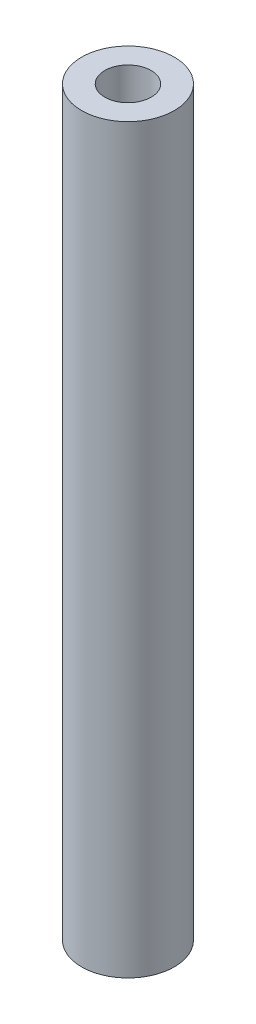
ISO-10303-21;
HEADER;
FILE_DESCRIPTION(('STEP AP214'),'2;1');
FILE_NAME('part.step','',(''),(''),'','','');
FILE_SCHEMA(('AUTOMOTIVE_DESIGN { 1 0 10303 214 1 1 1 1 }'));
ENDSEC;
DATA;
#1=APPLICATION_CONTEXT('core data for automotive mechanical design processes');
#2=APPLICATION_PROTOCOL_DEFINITION('international standard','automotive_design',2000,#1);
#3=PRODUCT_CONTEXT('',#1,'mechanical');
#4=PRODUCT('Part','Part','',(#3));
#5=PRODUCT_RELATED_PRODUCT_CATEGORY('part','',(#4));
#6=PRODUCT_DEFINITION_FORMATION('','',#4);
#7=PRODUCT_DEFINITION_CONTEXT('part definition',#1,'design');
#8=PRODUCT_DEFINITION('design','',#6,#7);
#9=PRODUCT_DEFINITION_SHAPE('','',#8);
#10=(LENGTH_UNIT() NAMED_UNIT(*) SI_UNIT(.MILLI.,.METRE.));
#11=(NAMED_UNIT(*) PLANE_ANGLE_UNIT() SI_UNIT($,.RADIAN.));
#12=(NAMED_UNIT(*) SI_UNIT($,.STERADIAN.) SOLID_ANGLE_UNIT());
#13=UNCERTAINTY_MEASURE_WITH_UNIT(LENGTH_MEASURE(1.E-05),#10,'distance_accuracy_value','');
#14=(GEOMETRIC_REPRESENTATION_CONTEXT(3) GLOBAL_UNCERTAINTY_ASSIGNED_CONTEXT((#13)) GLOBAL_UNIT_ASSIGNED_CONTEXT((#10,
#11,#12)) REPRESENTATION_CONTEXT('',''));
#15=CARTESIAN_POINT('',(0.,0.,0.));
#16=DIRECTION('',(0.,0.,1.));
#17=DIRECTION('',(1.,0.,0.));
#18=AXIS2_PLACEMENT_3D('',#15,#16,#17);
#19=CARTESIAN_POINT('',(0.,40.,0.));
#20=DIRECTION('',(0.,1.,0.));
#21=DIRECTION('',(0.,0.,1.));
#22=AXIS2_PLACEMENT_3D('',#19,#20,#21);
#23=PLANE('',#22);
#24=CARTESIAN_POINT('',(0.,40.,0.));
#25=DIRECTION('',(0.,1.,0.));
#26=DIRECTION('',(0.,0.,1.));
#27=AXIS2_PLACEMENT_3D('',#24,#25,#26);
#28=CIRCLE('',#27,2.5);
#29=CARTESIAN_POINT('',(0.,40.,2.5));
#30=VERTEX_POINT('',#29);
#31=EDGE_CURVE('E10',#30,#30,#28,.T.);
#32=ORIENTED_EDGE('',*,*,#31,.T.);
#33=EDGE_LOOP('',(#32));
#34=FACE_BOUND('',#33,.T.);
#35=CARTESIAN_POINT('',(0.,40.,0.));
#36=DIRECTION('',(0.,1.,0.));
#37=DIRECTION('',(0.,0.,1.));
#38=AXIS2_PLACEMENT_3D('',#35,#36,#37);
#39=CIRCLE('',#38,1.25);
#40=CARTESIAN_POINT('',(0.,40.,1.25));
#41=VERTEX_POINT('',#40);
#42=EDGE_CURVE('E44',#41,#41,#39,.T.);
#43=ORIENTED_EDGE('',*,*,#42,.F.);
#44=EDGE_LOOP('',(#43));
#45=FACE_BOUND('',#44,.T.);
#46=ADVANCED_FACE('F33',(#34,#45),#23,.T.);
#47=CARTESIAN_POINT('',(0.,0.,0.));
#48=DIRECTION('',(0.,1.,0.));
#49=DIRECTION('',(0.,0.,1.));
#50=AXIS2_PLACEMENT_3D('',#47,#48,#49);
#51=PLANE('',#50);
#52=CARTESIAN_POINT('',(0.,0.,0.));
#53=DIRECTION('',(0.,1.,0.));
#54=DIRECTION('',(0.,0.,1.));
#55=AXIS2_PLACEMENT_3D('',#52,#53,#54);
#56=CIRCLE('',#55,2.5);
#57=CARTESIAN_POINT('',(0.,0.,2.5));
#58=VERTEX_POINT('',#57);
#59=EDGE_CURVE('E37',#58,#58,#56,.T.);
#60=ORIENTED_EDGE('',*,*,#59,.F.);
#61=EDGE_LOOP('',(#60));
#62=FACE_BOUND('',#61,.T.);
#63=CARTESIAN_POINT('',(0.,0.,0.));
#64=DIRECTION('',(0.,1.,0.));
#65=DIRECTION('',(0.,0.,1.));
#66=AXIS2_PLACEMENT_3D('',#63,#64,#65);
#67=CIRCLE('',#66,1.25);
#68=CARTESIAN_POINT('',(0.,0.,1.25));
#69=VERTEX_POINT('',#68);
#70=EDGE_CURVE('E46',#69,#69,#67,.T.);
#71=ORIENTED_EDGE('',*,*,#70,.T.);
#72=EDGE_LOOP('',(#71));
#73=FACE_BOUND('',#72,.T.);
#74=ADVANCED_FACE('F56',(#62,#73),#51,.F.);
#75=CARTESIAN_POINT('',(0.,40.,0.));
#76=DIRECTION('',(0.,-1.,0.));
#77=DIRECTION('',(0.,0.,-1.));
#78=AXIS2_PLACEMENT_3D('',#75,#76,#77);
#79=CYLINDRICAL_SURFACE('',#78,2.5);
#80=ORIENTED_EDGE('',*,*,#31,.F.);
#81=EDGE_LOOP('',(#80));
#82=FACE_BOUND('',#81,.T.);
#83=ORIENTED_EDGE('',*,*,#59,.T.);
#84=EDGE_LOOP('',(#83));
#85=FACE_BOUND('',#84,.T.);
#86=ADVANCED_FACE('F35',(#82,#85),#79,.T.);
#87=CARTESIAN_POINT('',(0.,40.,0.));
#88=DIRECTION('',(0.,-1.,0.));
#89=DIRECTION('',(0.,0.,-1.));
#90=AXIS2_PLACEMENT_3D('',#87,#88,#89);
#91=CYLINDRICAL_SURFACE('',#90,1.25);
#92=ORIENTED_EDGE('',*,*,#42,.T.);
#93=EDGE_LOOP('',(#92));
#94=FACE_BOUND('',#93,.T.);
#95=ORIENTED_EDGE('',*,*,#70,.F.);
#96=EDGE_LOOP('',(#95));
#97=FACE_BOUND('',#96,.T.);
#98=ADVANCED_FACE('F52',(#94,#97),#91,.F.);
#99=CLOSED_SHELL('',(#46,#74,#86,#98));
#100=MANIFOLD_SOLID_BREP('B2',#99);
#101=ADVANCED_BREP_SHAPE_REPRESENTATION('',(#18,#100),#14);
#102=SHAPE_DEFINITION_REPRESENTATION(#9,#101);
ENDSEC;
END-ISO-10303-21;
